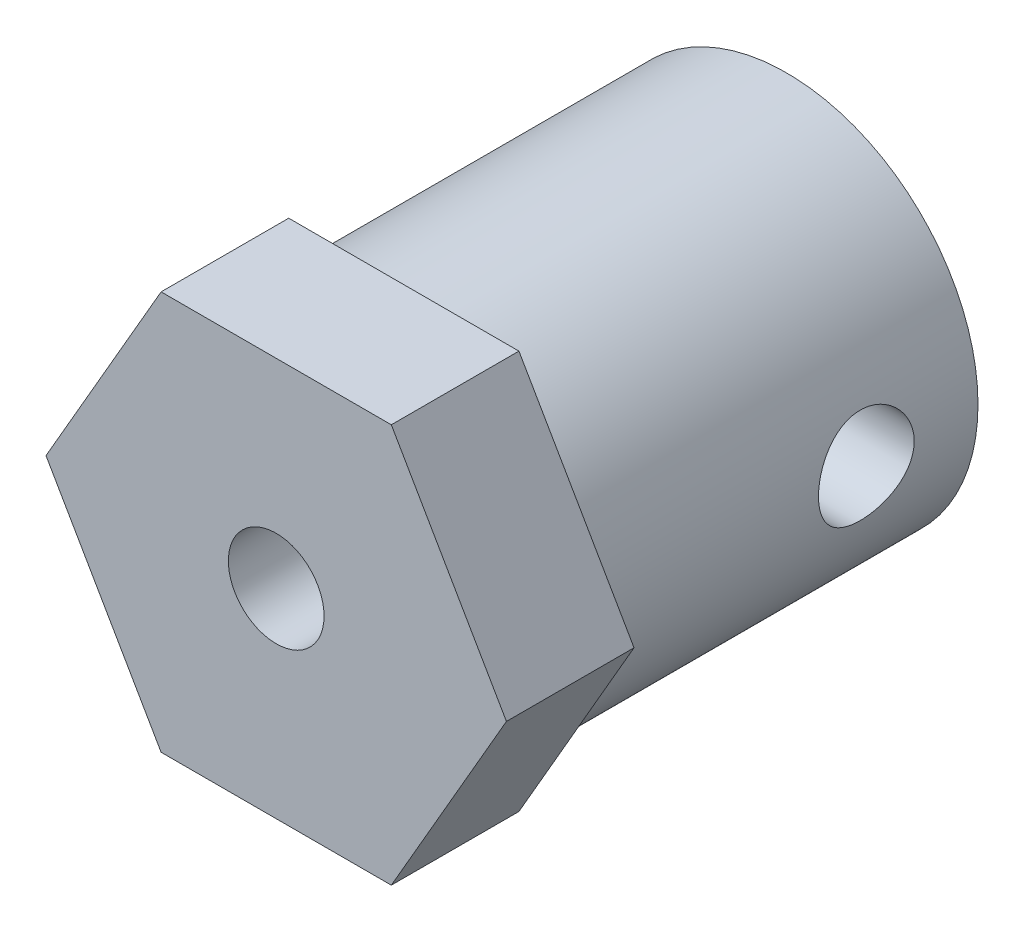
ISO-10303-21;
HEADER;
FILE_DESCRIPTION(('STEP AP214'),'2;1');
FILE_NAME('part.step','',(''),(''),'','','');
FILE_SCHEMA(('AUTOMOTIVE_DESIGN { 1 0 10303 214 1 1 1 1 }'));
ENDSEC;
DATA;
#1=APPLICATION_CONTEXT('core data for automotive mechanical design processes');
#2=APPLICATION_PROTOCOL_DEFINITION('international standard','automotive_design',2000,#1);
#3=PRODUCT_CONTEXT('',#1,'mechanical');
#4=PRODUCT('Part','Part','',(#3));
#5=PRODUCT_RELATED_PRODUCT_CATEGORY('part','',(#4));
#6=PRODUCT_DEFINITION_FORMATION('','',#4);
#7=PRODUCT_DEFINITION_CONTEXT('part definition',#1,'design');
#8=PRODUCT_DEFINITION('design','',#6,#7);
#9=PRODUCT_DEFINITION_SHAPE('','',#8);
#10=(LENGTH_UNIT() NAMED_UNIT(*) SI_UNIT(.MILLI.,.METRE.));
#11=(NAMED_UNIT(*) PLANE_ANGLE_UNIT() SI_UNIT($,.RADIAN.));
#12=(NAMED_UNIT(*) SI_UNIT($,.STERADIAN.) SOLID_ANGLE_UNIT());
#13=UNCERTAINTY_MEASURE_WITH_UNIT(LENGTH_MEASURE(1.E-05),#10,'distance_accuracy_value','');
#14=(GEOMETRIC_REPRESENTATION_CONTEXT(3) GLOBAL_UNCERTAINTY_ASSIGNED_CONTEXT((#13)) GLOBAL_UNIT_ASSIGNED_CONTEXT((#10,
#11,#12)) REPRESENTATION_CONTEXT('',''));
#15=CARTESIAN_POINT('',(0.,0.,0.));
#16=DIRECTION('',(0.,0.,1.));
#17=DIRECTION('',(1.,0.,0.));
#18=AXIS2_PLACEMENT_3D('',#15,#16,#17);
#19=CARTESIAN_POINT('',(0.,0.,-12.));
#20=DIRECTION('',(0.,0.,1.));
#21=DIRECTION('',(1.,0.,0.));
#22=AXIS2_PLACEMENT_3D('',#19,#20,#21);
#23=CYLINDRICAL_SURFACE('',#22,6.);
#24=CARTESIAN_POINT('',(0.,0.,-12.));
#25=DIRECTION('',(0.,0.,-1.));
#26=DIRECTION('',(-1.,0.,0.));
#27=AXIS2_PLACEMENT_3D('',#24,#25,#26);
#28=CIRCLE('',#27,6.);
#29=CARTESIAN_POINT('',(-6.,0.,-12.));
#30=VERTEX_POINT('',#29);
#31=EDGE_CURVE('E192',#30,#30,#28,.T.);
#32=ORIENTED_EDGE('',*,*,#31,.F.);
#33=EDGE_LOOP('',(#32));
#34=FACE_BOUND('',#33,.T.);
#35=CARTESIAN_POINT('',(0.,0.,0.));
#36=DIRECTION('',(0.,0.,-1.));
#37=DIRECTION('',(-1.,0.,0.));
#38=AXIS2_PLACEMENT_3D('',#35,#36,#37);
#39=CIRCLE('',#38,6.);
#40=CARTESIAN_POINT('',(-6.,0.,0.));
#41=VERTEX_POINT('',#40);
#42=EDGE_CURVE('E12',#41,#41,#39,.T.);
#43=ORIENTED_EDGE('',*,*,#42,.T.);
#44=EDGE_LOOP('',(#43));
#45=FACE_BOUND('',#44,.T.);
#46=CARTESIAN_POINT('',(6.,0.,-10.));
#47=CARTESIAN_POINT('',(5.99999859868013,0.082876088669731,-9.99999767426184));
#48=CARTESIAN_POINT('',(5.99826578131828,0.165778157830763,-9.99310844922621));
#49=CARTESIAN_POINT('',(5.99152113829892,0.329206323770532,-9.96577484869299));
#50=CARTESIAN_POINT('',(5.98650745419968,0.409731046870738,-9.94532279046215));
#51=CARTESIAN_POINT('',(5.9737562633204,0.566020872182576,-9.89156074653791));
#52=CARTESIAN_POINT('',(5.96602202842087,0.641791563430002,-9.85826620128472));
#53=CARTESIAN_POINT('',(5.94865343807593,0.786672131904425,-9.77981860995517));
#54=CARTESIAN_POINT('',(5.9390190185405,0.855781784348758,-9.73466516388106));
#55=CARTESIAN_POINT('',(5.91867413591801,0.986801927300918,-9.63279921034579));
#56=CARTESIAN_POINT('',(5.90794707148533,1.04855569006107,-9.57588842504082));
#57=CARTESIAN_POINT('',(5.8867362011753,1.1617489272033,-9.45254779509108));
#58=CARTESIAN_POINT('',(5.87625242288349,1.21318723694913,-9.3861168770535));
#59=CARTESIAN_POINT('',(5.8565477569971,1.30502654279903,-9.24440477326256));
#60=CARTESIAN_POINT('',(5.84734794470605,1.34525221592535,-9.1690067691896));
#61=CARTESIAN_POINT('',(5.83149494812223,1.41239690855052,-9.01225158834164));
#62=CARTESIAN_POINT('',(5.82484135672789,1.43931805543933,-8.93089536667424));
#63=CARTESIAN_POINT('',(5.81500476717551,1.47855483680429,-8.76625650179752));
#64=CARTESIAN_POINT('',(5.81175491075426,1.49115226833334,-8.6830451039502));
#65=CARTESIAN_POINT('',(5.80889362537741,1.50226177506785,-8.51563143098602));
#66=CARTESIAN_POINT('',(5.80928160448644,1.50077614181798,-8.43142931930139));
#67=CARTESIAN_POINT('',(5.81359205496618,1.48398652463928,-8.26658419225552));
#68=CARTESIAN_POINT('',(5.81742863001879,1.46901834019052,-8.18590437853491));
#69=CARTESIAN_POINT('',(5.82806709676484,1.4262241869031,-8.02823894908871));
#70=CARTESIAN_POINT('',(5.83486919970697,1.39839730206942,-7.95125359697102));
#71=CARTESIAN_POINT('',(5.85075113904187,1.33038947793715,-7.80226198374794));
#72=CARTESIAN_POINT('',(5.85985327469421,1.29008666723291,-7.73031382821045));
#73=CARTESIAN_POINT('',(5.87929710846386,1.19835627601495,-7.59408129024316));
#74=CARTESIAN_POINT('',(5.88963902334735,1.14692674880884,-7.52979825193275));
#75=CARTESIAN_POINT('',(5.91075880539781,1.03266342468121,-7.4087963843056));
#76=CARTESIAN_POINT('',(5.92154069477971,0.969546258165857,-7.35234550993865));
#77=CARTESIAN_POINT('',(5.94205965578786,0.834611917503697,-7.2507787575361));
#78=CARTESIAN_POINT('',(5.95179669549415,0.762794477707941,-7.20566322573644));
#79=CARTESIAN_POINT('',(5.96917732094183,0.612115888681389,-7.12794941377562));
#80=CARTESIAN_POINT('',(5.97681360127725,0.533231393208621,-7.09539465974558));
#81=CARTESIAN_POINT('',(5.98907916991419,0.370876008142881,-7.04408269429043));
#82=CARTESIAN_POINT('',(5.99370903339281,0.287405999150484,-7.02532284358187));
#83=CARTESIAN_POINT('',(5.99935499271375,0.120539970390027,-7.00254243444117));
#84=CARTESIAN_POINT('',(6.00046053508279,0.0371967199882096,-6.9981569739247));
#85=CARTESIAN_POINT('',(5.99918804814451,-0.129032874801508,-7.00324900205549));
#86=CARTESIAN_POINT('',(5.99681033241847,-0.211919259644595,-7.01272524279914));
#87=CARTESIAN_POINT('',(5.98889581127357,-0.373614268776491,-7.04497090839138));
#88=CARTESIAN_POINT('',(5.98340634185811,-0.452465118968754,-7.06754126347699));
#89=CARTESIAN_POINT('',(5.96988706634134,-0.60525729245251,-7.12510708402845));
#90=CARTESIAN_POINT('',(5.96185700369892,-0.679198119032633,-7.16010380431317));
#91=CARTESIAN_POINT('',(5.9439330792631,-0.821523134429846,-7.24223612887473));
#92=CARTESIAN_POINT('',(5.93400867366932,-0.889785441835829,-7.28957611239677));
#93=CARTESIAN_POINT('',(5.91344509187419,-1.01752661364324,-7.39478990879697));
#94=CARTESIAN_POINT('',(5.90280579251705,-1.07700395897301,-7.45266553961691));
#95=CARTESIAN_POINT('',(5.88168956960771,-1.18699056807273,-7.57900196084447));
#96=CARTESIAN_POINT('',(5.87122304187281,-1.23724386762203,-7.64768770300243));
#97=CARTESIAN_POINT('',(5.85192878377239,-1.3255107590127,-7.79273263446572));
#98=CARTESIAN_POINT('',(5.84310098067026,-1.36352489415793,-7.86909148295976));
#99=CARTESIAN_POINT('',(5.82818094734665,-1.42595142060929,-8.02690572241308));
#100=CARTESIAN_POINT('',(5.82207255291906,-1.45044439665406,-8.10832762834401));
#101=CARTESIAN_POINT('',(5.81326744090184,-1.48534565995378,-8.27430963788911));
#102=CARTESIAN_POINT('',(5.81056997719936,-1.49575702747865,-8.35886905103249));
#103=CARTESIAN_POINT('',(5.80894901203957,-1.50203859033399,-8.5261210238552));
#104=CARTESIAN_POINT('',(5.80991932728264,-1.49831789778011,-8.60879743512473));
#105=CARTESIAN_POINT('',(5.81527909007843,-1.47737727831286,-8.77230388866798));
#106=CARTESIAN_POINT('',(5.81966846891857,-1.46015762268677,-8.85313396801365));
#107=CARTESIAN_POINT('',(5.83131260682723,-1.41293131944279,-9.01020845906541));
#108=CARTESIAN_POINT('',(5.8385501523631,-1.38300140468037,-9.08647730524021));
#109=CARTESIAN_POINT('',(5.85507755724829,-1.31126491360507,-9.23296538271369));
#110=CARTESIAN_POINT('',(5.86436770120773,-1.26945669003419,-9.30318377318692));
#111=CARTESIAN_POINT('',(5.88425634263512,-1.17386774863713,-9.43755462900202));
#112=CARTESIAN_POINT('',(5.89488264831757,-1.11980316291225,-9.50150107342396));
#113=CARTESIAN_POINT('',(5.91608027246286,-1.00178937118973,-9.61954704479541));
#114=CARTESIAN_POINT('',(5.9266515772706,-0.937837821261142,-9.67364423011297));
#115=CARTESIAN_POINT('',(5.94677655647663,-0.800467586702587,-9.77141130856461));
#116=CARTESIAN_POINT('',(5.95630833365868,-0.726898422316384,-9.81487461367158));
#117=CARTESIAN_POINT('',(5.97304924975119,-0.573266059510474,-9.88874746294053));
#118=CARTESIAN_POINT('',(5.98026005199781,-0.493207563436737,-9.91916636064853));
#119=CARTESIAN_POINT('',(5.99048059565542,-0.34441025324347,-9.96157183032965));
#120=CARTESIAN_POINT('',(5.99402585052691,-0.276380170908067,-9.97595124305343));
#121=CARTESIAN_POINT('',(5.99878605231948,-0.138906071536282,-9.99516594362194));
#122=CARTESIAN_POINT('',(6.00000117450894,-0.0694621612426158,-10.0000019493053));
#123=CARTESIAN_POINT('',(6.,0.,-10.));
#124=B_SPLINE_CURVE_WITH_KNOTS('',3,(#46,#47,#48,#49,#50,#51,#52,#53,#54,#55,#56,#57,#58,#59,
#60,#61,#62,#63,#64,#65,#66,#67,#68,#69,#70,#71,#72,#73,#74,#75,#76,#77,#78,#79,#80,#81,#82,#83,
#84,#85,#86,#87,#88,#89,#90,#91,#92,#93,#94,#95,#96,#97,#98,#99,#100,#101,#102,#103,#104,#105,
#106,#107,#108,#109,#110,#111,#112,#113,#114,#115,#116,#117,#118,#119,#120,#121,#122,#123),
.UNSPECIFIED.,.T.,.F.,(4,2,2,2,2,2,2,2,2,2,2,2,2,2,2,2,2,2,2,2,2,2,2,2,2,2,2,2,2,2,2,2,2,2,2,2,
2,2,4),(0.,0.248373712471889,0.496888237763899,0.745104902286104,0.993329940169327,
1.24614435437139,1.49898729580062,1.75558647545806,2.01214461169368,2.2635629509943,
2.51494038112696,2.76022497007017,3.00552703466038,3.25330527873878,3.50112690836162,
3.75601500969019,4.01091089558246,4.26668229009113,4.52240473688642,4.77158308949275,
5.02073901112742,5.26620274514036,5.51169127322289,5.76153587565351,6.01142363008018,
6.26744509204475,6.52345518749507,6.77792254614035,7.03233423252406,7.27943780398611,
7.52653640956033,7.77216400559445,8.017825681369,8.26989576409908,8.52202569770416,
8.77872185499586,9.03523363821348,9.24342242942147,9.45159556043037),.UNSPECIFIED.);
#125=CARTESIAN_POINT('',(6.,0.,-10.));
#126=VERTEX_POINT('',#125);
#127=EDGE_CURVE('E204',#126,#126,#124,.T.);
#128=ORIENTED_EDGE('',*,*,#127,.F.);
#129=EDGE_LOOP('',(#128));
#130=FACE_BOUND('',#129,.T.);
#131=ADVANCED_FACE('F45',(#34,#45,#130),#23,.T.);
#132=CARTESIAN_POINT('',(0.,0.,-12.));
#133=DIRECTION('',(0.,0.,1.));
#134=DIRECTION('',(1.,0.,0.));
#135=AXIS2_PLACEMENT_3D('',#132,#133,#134);
#136=CYLINDRICAL_SURFACE('',#135,3.175);
#137=CARTESIAN_POINT('',(0.,0.,0.));
#138=DIRECTION('',(0.,0.,-1.));
#139=DIRECTION('',(-1.,0.,0.));
#140=AXIS2_PLACEMENT_3D('',#137,#138,#139);
#141=CIRCLE('',#140,3.175);
#142=CARTESIAN_POINT('',(-3.175,0.,0.));
#143=VERTEX_POINT('',#142);
#144=EDGE_CURVE('E200',#143,#143,#141,.T.);
#145=ORIENTED_EDGE('',*,*,#144,.F.);
#146=EDGE_LOOP('',(#145));
#147=FACE_BOUND('',#146,.T.);
#148=CARTESIAN_POINT('',(0.,0.,-12.));
#149=DIRECTION('',(0.,0.,-1.));
#150=DIRECTION('',(-1.,0.,0.));
#151=AXIS2_PLACEMENT_3D('',#148,#149,#150);
#152=CIRCLE('',#151,3.175);
#153=CARTESIAN_POINT('',(-3.175,0.,-12.));
#154=VERTEX_POINT('',#153);
#155=EDGE_CURVE('E199',#154,#154,#152,.T.);
#156=ORIENTED_EDGE('',*,*,#155,.T.);
#157=EDGE_LOOP('',(#156));
#158=FACE_BOUND('',#157,.T.);
#159=CARTESIAN_POINT('',(3.175,0.,-10.));
#160=CARTESIAN_POINT('',(3.17499621985294,0.0793696056331877,-9.99999552610351));
#161=CARTESIAN_POINT('',(3.17199120370814,0.158848966213319,-9.99366335348418));
#162=CARTESIAN_POINT('',(3.16026762742416,0.3154907966577,-9.9685996128575));
#163=CARTESIAN_POINT('',(3.15153670753249,0.392647876041672,-9.94984122112576));
#164=CARTESIAN_POINT('',(3.1292818514019,0.542134614016449,-9.90080463386028));
#165=CARTESIAN_POINT('',(3.11577583396693,0.614481134826973,-9.87056947468804));
#166=CARTESIAN_POINT('',(3.08523557557938,0.75298275747988,-9.79964446831745));
#167=CARTESIAN_POINT('',(3.06820187122341,0.819138798737004,-9.75895621091421));
#168=CARTESIAN_POINT('',(3.03109215002452,0.947531977551391,-9.66568662754687));
#169=CARTESIAN_POINT('',(3.01089949607389,1.00934531536298,-9.61256891765261));
#170=CARTESIAN_POINT('',(2.97016877751052,1.12356872804671,-9.49709401541805));
#171=CARTESIAN_POINT('',(2.94963048974006,1.17597245123061,-9.43473063351147));
#172=CARTESIAN_POINT('',(2.90895734211161,1.27340721108708,-9.29748436454971));
#173=CARTESIAN_POINT('',(2.88894252906622,1.31770529611402,-9.22204154314482));
#174=CARTESIAN_POINT('',(2.85350194913633,1.39279860497067,-9.06371450605077));
#175=CARTESIAN_POINT('',(2.83807319122875,1.4236026358555,-8.98083518657092));
#176=CARTESIAN_POINT('',(2.81484981523147,1.46896762087975,-8.81481732997647));
#177=CARTESIAN_POINT('',(2.80667245171199,1.48434942407678,-8.73195910458647));
#178=CARTESIAN_POINT('',(2.79782290647243,1.50096994970779,-8.56446669966953));
#179=CARTESIAN_POINT('',(2.79714463118969,1.5022201551264,-8.47983401805994));
#180=CARTESIAN_POINT('',(2.80305593263809,1.49114871052962,-8.32062469140227));
#181=CARTESIAN_POINT('',(2.80889771224103,1.48022366031688,-8.24591684055565));
#182=CARTESIAN_POINT('',(2.82589657910715,1.44750469243097,-8.09955531913525));
#183=CARTESIAN_POINT('',(2.83705508237193,1.42570787921159,-8.02790246774061));
#184=CARTESIAN_POINT('',(2.86368711079333,1.37144042107045,-7.88767854274785));
#185=CARTESIAN_POINT('',(2.87925460442575,1.33873421633753,-7.8192173067294));
#186=CARTESIAN_POINT('',(2.91294481240157,1.26375034917988,-7.68844422930819));
#187=CARTESIAN_POINT('',(2.93106865023239,1.22146847336964,-7.62613511227864));
#188=CARTESIAN_POINT('',(2.97027967308475,1.12301829304093,-7.50211398210142));
#189=CARTESIAN_POINT('',(2.99147184174414,1.06582685913966,-7.44124465826451));
#190=CARTESIAN_POINT('',(3.03276969244738,0.941911654521735,-7.32963307898786));
#191=CARTESIAN_POINT('',(3.05287495516681,0.875184240523145,-7.27889471198726));
#192=CARTESIAN_POINT('',(3.09065813188422,0.730900451942523,-7.18723446950541));
#193=CARTESIAN_POINT('',(3.10821737934191,0.653032764749387,-7.14674987490941));
#194=CARTESIAN_POINT('',(3.13795896561378,0.490549806409962,-7.07976514725873));
#195=CARTESIAN_POINT('',(3.15014513198241,0.405939389394614,-7.05325505672055));
#196=CARTESIAN_POINT('',(3.16698849385516,0.239325331183661,-7.01695327830055));
#197=CARTESIAN_POINT('',(3.17215069636453,0.157618085372368,-7.00603697774867));
#198=CARTESIAN_POINT('',(3.17605374308904,-0.00662006237334249,-6.99776549827472));
#199=CARTESIAN_POINT('',(3.17479716715133,-0.0891506200914338,-7.00040487103399));
#200=CARTESIAN_POINT('',(3.16631250425399,-0.246790904756256,-7.01845895022594));
#201=CARTESIAN_POINT('',(3.15949303898597,-0.322025617263289,-7.03299968212115));
#202=CARTESIAN_POINT('',(3.14106249856194,-0.468859911387633,-7.07312746629385));
#203=CARTESIAN_POINT('',(3.12945086824544,-0.540459070755479,-7.09871579842439));
#204=CARTESIAN_POINT('',(3.10206629000487,-0.680482664613306,-7.16097277598054));
#205=CARTESIAN_POINT('',(3.0861775760538,-0.748744433690326,-7.19795459585581));
#206=CARTESIAN_POINT('',(3.05182842645659,-0.878333413113473,-7.28160542554883));
#207=CARTESIAN_POINT('',(3.0333668635778,-0.939657562453441,-7.32827868585653));
#208=CARTESIAN_POINT('',(2.99374847615918,-1.05944471500474,-7.4348401643062));
#209=CARTESIAN_POINT('',(2.97249840501299,-1.11715821701518,-7.49553803008256));
#210=CARTESIAN_POINT('',(2.9310107026401,-1.22187582163969,-7.6259200433733));
#211=CARTESIAN_POINT('',(2.91077359415055,-1.26887443843489,-7.69560876557418));
#212=CARTESIAN_POINT('',(2.8729842223829,-1.3523177360002,-7.84515860569976));
#213=CARTESIAN_POINT('',(2.85555063245793,-1.3883357483136,-7.9252902768506));
#214=CARTESIAN_POINT('',(2.82679504093384,-1.44599796651068,-8.09157573608092));
#215=CARTESIAN_POINT('',(2.81546607860886,-1.46765854978946,-8.17772253828127));
#216=CARTESIAN_POINT('',(2.80148148307169,-1.49416555358527,-8.34513659709301));
#217=CARTESIAN_POINT('',(2.79812792823293,-1.50036748851185,-8.42613047173134));
#218=CARTESIAN_POINT('',(2.79854075870542,-1.4995991124721,-8.58802567182791));
#219=CARTESIAN_POINT('',(2.80230499174775,-1.49263278331129,-8.66892701786345));
#220=CARTESIAN_POINT('',(2.81582109373829,-1.46695547456854,-8.82186185816675));
#221=CARTESIAN_POINT('',(2.82509293077013,-1.44918362899974,-8.894100315709));
#222=CARTESIAN_POINT('',(2.84807658169596,-1.40347262111118,-9.03452895410737));
#223=CARTESIAN_POINT('',(2.86178973121637,-1.37553039996267,-9.1027179098565));
#224=CARTESIAN_POINT('',(2.89323433363553,-1.30816165903835,-9.23811055182919));
#225=CARTESIAN_POINT('',(2.9111726221189,-1.26809407534009,-9.30494596956031));
#226=CARTESIAN_POINT('',(2.94862781691945,-1.17838069734069,-9.43136079818433));
#227=CARTESIAN_POINT('',(2.96814547541437,-1.12873032344155,-9.49093671747963));
#228=CARTESIAN_POINT('',(3.00898948839188,-1.01518945377103,-9.6075560784686));
#229=CARTESIAN_POINT('',(3.03029315236505,-0.950355540908528,-9.66369381341707));
#230=CARTESIAN_POINT('',(3.07039060771353,-0.811506446201228,-9.76444175427494));
#231=CARTESIAN_POINT('',(3.08918318329392,-0.737486850130152,-9.80904638589811));
#232=CARTESIAN_POINT('',(3.12214803509559,-0.582310323359665,-9.8850463197749));
#233=CARTESIAN_POINT('',(3.13633626105316,-0.501179295246571,-9.91648733383919));
#234=CARTESIAN_POINT('',(3.15849550789229,-0.334041202489529,-9.96490242402554));
#235=CARTESIAN_POINT('',(3.16648489362115,-0.248049357078896,-9.98191924759625));
#236=CARTESIAN_POINT('',(3.17226666174443,-0.134449327489633,-9.99420643339842));
#237=CARTESIAN_POINT('',(3.17328951708221,-0.107619750816228,-9.99637655199677));
#238=CARTESIAN_POINT('',(3.17465683516496,-0.0538643319459671,-9.99927411038089));
#239=CARTESIAN_POINT('',(3.17500128300303,-0.0269384876468124,-10.0000015184655));
#240=CARTESIAN_POINT('',(3.175,0.,-10.));
#241=B_SPLINE_CURVE_WITH_KNOTS('',3,(#159,#160,#161,#162,#163,#164,#165,#166,#167,#168,#169,
#170,#171,#172,#173,#174,#175,#176,#177,#178,#179,#180,#181,#182,#183,#184,#185,#186,#187,#188,
#189,#190,#191,#192,#193,#194,#195,#196,#197,#198,#199,#200,#201,#202,#203,#204,#205,#206,#207,
#208,#209,#210,#211,#212,#213,#214,#215,#216,#217,#218,#219,#220,#221,#222,#223,#224,#225,#226,
#227,#228,#229,#230,#231,#232,#233,#234,#235,#236,#237,#238,#239,#240),.UNSPECIFIED.,.T.,.F.,(4,
2,2,2,2,2,2,2,2,2,2,2,2,2,2,2,2,2,2,2,2,2,2,2,2,2,2,2,2,2,2,2,2,2,2,2,2,2,2,2,4),(0.,
0.237998863435126,0.47651316203436,0.714141760487185,0.951734239756923,1.202566267352,
1.45356698050229,1.72144991719772,1.98915775546694,2.24170968929962,2.4940563909499,
2.72018464462581,2.94637315667183,3.17780125644151,3.40933138528568,3.66670059385931,
3.92416839616743,4.19124985366181,4.45814074508091,4.70459764976703,4.95095550583969,
5.18069145066331,5.41045401730285,5.64720089890939,5.88405183355052,6.14213867221334,
6.40035735120201,6.66760822573516,6.93455372246491,7.17710763594644,7.41958821796885,
7.64352093670394,7.8675210608749,8.10644389425157,8.34548119240927,8.60934561245706,
8.87333732850239,9.13640455025374,9.39868939422997,9.47946576344204,9.56024390756226),.UNSPECIFIED.);
#242=CARTESIAN_POINT('',(3.175,0.,-10.));
#243=VERTEX_POINT('',#242);
#244=EDGE_CURVE('E49',#243,#243,#241,.T.);
#245=ORIENTED_EDGE('',*,*,#244,.T.);
#246=EDGE_LOOP('',(#245));
#247=FACE_BOUND('',#246,.T.);
#248=ADVANCED_FACE('F222',(#147,#158,#247),#136,.F.);
#249=CARTESIAN_POINT('',(0.,0.,0.));
#250=DIRECTION('',(0.,0.,1.));
#251=DIRECTION('',(1.,0.,0.));
#252=AXIS2_PLACEMENT_3D('',#249,#250,#251);
#253=PLANE('',#252);
#254=CARTESIAN_POINT('',(0.,0.,0.));
#255=DIRECTION('',(0.,0.,1.));
#256=DIRECTION('',(1.,0.,0.));
#257=AXIS2_PLACEMENT_3D('',#254,#255,#256);
#258=CIRCLE('',#257,1.5);
#259=CARTESIAN_POINT('',(1.5,0.,0.));
#260=VERTEX_POINT('',#259);
#261=EDGE_CURVE('E188',#260,#260,#258,.T.);
#262=ORIENTED_EDGE('',*,*,#261,.T.);
#263=EDGE_LOOP('',(#262));
#264=FACE_BOUND('',#263,.T.);
#265=ORIENTED_EDGE('',*,*,#144,.T.);
#266=EDGE_LOOP('',(#265));
#267=FACE_BOUND('',#266,.T.);
#268=ADVANCED_FACE('F226',(#264,#267),#253,.F.);
#269=CARTESIAN_POINT('',(0.,0.,4.));
#270=DIRECTION('',(0.,0.,1.));
#271=DIRECTION('',(1.,0.,0.));
#272=AXIS2_PLACEMENT_3D('',#269,#270,#271);
#273=PLANE('',#272);
#274=DIRECTION('',(-0.5,0.866025403784438,0.));
#275=VECTOR('',#274,1.);
#276=CARTESIAN_POINT('',(7.21687836487032,0.,4.));
#277=LINE('',#276,#275);
#278=CARTESIAN_POINT('',(7.21687836487032,0.,4.));
#279=VERTEX_POINT('',#278);
#280=CARTESIAN_POINT('',(3.60843918243516,6.25,4.));
#281=VERTEX_POINT('',#280);
#282=EDGE_CURVE('E161',#279,#281,#277,.T.);
#283=ORIENTED_EDGE('',*,*,#282,.T.);
#284=DIRECTION('',(-1.,0.,0.));
#285=VECTOR('',#284,1.);
#286=CARTESIAN_POINT('',(3.60843918243516,6.25,4.));
#287=LINE('',#286,#285);
#288=CARTESIAN_POINT('',(-3.60843918243516,6.25,4.));
#289=VERTEX_POINT('',#288);
#290=EDGE_CURVE('E108',#281,#289,#287,.T.);
#291=ORIENTED_EDGE('',*,*,#290,.T.);
#292=DIRECTION('',(-0.5,-0.866025403784439,0.));
#293=VECTOR('',#292,1.);
#294=CARTESIAN_POINT('',(-3.60843918243516,6.25,4.));
#295=LINE('',#294,#293);
#296=CARTESIAN_POINT('',(-7.21687836487032,0.,4.));
#297=VERTEX_POINT('',#296);
#298=EDGE_CURVE('E122',#289,#297,#295,.T.);
#299=ORIENTED_EDGE('',*,*,#298,.T.);
#300=DIRECTION('',(0.5,-0.866025403784438,0.));
#301=VECTOR('',#300,1.);
#302=CARTESIAN_POINT('',(-7.21687836487032,0.,4.));
#303=LINE('',#302,#301);
#304=CARTESIAN_POINT('',(-3.60843918243516,-6.25,4.));
#305=VERTEX_POINT('',#304);
#306=EDGE_CURVE('E115',#297,#305,#303,.T.);
#307=ORIENTED_EDGE('',*,*,#306,.T.);
#308=DIRECTION('',(1.,0.,0.));
#309=VECTOR('',#308,1.);
#310=CARTESIAN_POINT('',(-3.60843918243516,-6.25,4.));
#311=LINE('',#310,#309);
#312=CARTESIAN_POINT('',(3.60843918243516,-6.25,4.));
#313=VERTEX_POINT('',#312);
#314=EDGE_CURVE('E120',#305,#313,#311,.T.);
#315=ORIENTED_EDGE('',*,*,#314,.T.);
#316=DIRECTION('',(0.5,0.866025403784439,0.));
#317=VECTOR('',#316,1.);
#318=CARTESIAN_POINT('',(3.60843918243516,-6.25,4.));
#319=LINE('',#318,#317);
#320=EDGE_CURVE('E70',#313,#279,#319,.T.);
#321=ORIENTED_EDGE('',*,*,#320,.T.);
#322=EDGE_LOOP('',(#283,#291,#299,#307,#315,#321));
#323=FACE_BOUND('',#322,.T.);
#324=CARTESIAN_POINT('',(0.,0.,4.));
#325=DIRECTION('',(0.,0.,1.));
#326=DIRECTION('',(1.,0.,0.));
#327=AXIS2_PLACEMENT_3D('',#324,#325,#326);
#328=CIRCLE('',#327,1.5);
#329=CARTESIAN_POINT('',(1.5,0.,4.));
#330=VERTEX_POINT('',#329);
#331=EDGE_CURVE('E149',#330,#330,#328,.T.);
#332=ORIENTED_EDGE('',*,*,#331,.F.);
#333=EDGE_LOOP('',(#332));
#334=FACE_BOUND('',#333,.T.);
#335=ADVANCED_FACE('F117',(#323,#334),#273,.T.);
#336=ORIENTED_EDGE('',*,*,#42,.F.);
#337=EDGE_LOOP('',(#336));
#338=FACE_BOUND('',#337,.T.);
#339=DIRECTION('',(-0.5,0.866025403784438,0.));
#340=VECTOR('',#339,1.);
#341=CARTESIAN_POINT('',(7.21687836487032,0.,0.));
#342=LINE('',#341,#340);
#343=CARTESIAN_POINT('',(7.21687836487032,0.,0.));
#344=VERTEX_POINT('',#343);
#345=CARTESIAN_POINT('',(3.60843918243516,6.25,0.));
#346=VERTEX_POINT('',#345);
#347=EDGE_CURVE('E144',#344,#346,#342,.T.);
#348=ORIENTED_EDGE('',*,*,#347,.F.);
#349=DIRECTION('',(0.5,0.866025403784439,0.));
#350=VECTOR('',#349,1.);
#351=CARTESIAN_POINT('',(3.60843918243516,-6.25,0.));
#352=LINE('',#351,#350);
#353=CARTESIAN_POINT('',(3.60843918243516,-6.25,0.));
#354=VERTEX_POINT('',#353);
#355=EDGE_CURVE('E99',#354,#344,#352,.T.);
#356=ORIENTED_EDGE('',*,*,#355,.F.);
#357=DIRECTION('',(1.,0.,0.));
#358=VECTOR('',#357,1.);
#359=CARTESIAN_POINT('',(-3.60843918243516,-6.25,0.));
#360=LINE('',#359,#358);
#361=CARTESIAN_POINT('',(-3.60843918243516,-6.25,0.));
#362=VERTEX_POINT('',#361);
#363=EDGE_CURVE('E93',#362,#354,#360,.T.);
#364=ORIENTED_EDGE('',*,*,#363,.F.);
#365=DIRECTION('',(0.5,-0.866025403784438,0.));
#366=VECTOR('',#365,1.);
#367=CARTESIAN_POINT('',(-7.21687836487032,0.,0.));
#368=LINE('',#367,#366);
#369=CARTESIAN_POINT('',(-7.21687836487032,0.,0.));
#370=VERTEX_POINT('',#369);
#371=EDGE_CURVE('E131',#370,#362,#368,.T.);
#372=ORIENTED_EDGE('',*,*,#371,.F.);
#373=DIRECTION('',(-0.5,-0.866025403784439,0.));
#374=VECTOR('',#373,1.);
#375=CARTESIAN_POINT('',(-3.60843918243516,6.25,0.));
#376=LINE('',#375,#374);
#377=CARTESIAN_POINT('',(-3.60843918243516,6.25,0.));
#378=VERTEX_POINT('',#377);
#379=EDGE_CURVE('E152',#378,#370,#376,.T.);
#380=ORIENTED_EDGE('',*,*,#379,.F.);
#381=DIRECTION('',(-1.,0.,0.));
#382=VECTOR('',#381,1.);
#383=CARTESIAN_POINT('',(3.60843918243516,6.25,0.));
#384=LINE('',#383,#382);
#385=EDGE_CURVE('E148',#346,#378,#384,.T.);
#386=ORIENTED_EDGE('',*,*,#385,.F.);
#387=EDGE_LOOP('',(#348,#356,#364,#372,#380,#386));
#388=FACE_BOUND('',#387,.T.);
#389=ADVANCED_FACE('F178',(#338,#388),#253,.F.);
#390=CARTESIAN_POINT('',(7.21687836487032,0.,4.));
#391=DIRECTION('',(-0.866025403784438,-0.5,0.));
#392=DIRECTION('',(0.5,-0.866025403784439,0.));
#393=AXIS2_PLACEMENT_3D('',#390,#391,#392);
#394=PLANE('',#393);
#395=ORIENTED_EDGE('',*,*,#347,.T.);
#396=DIRECTION('',(0.,0.,-1.));
#397=VECTOR('',#396,1.);
#398=CARTESIAN_POINT('',(3.60843918243516,6.25,4.));
#399=LINE('',#398,#397);
#400=EDGE_CURVE('E61',#281,#346,#399,.T.);
#401=ORIENTED_EDGE('',*,*,#400,.F.);
#402=ORIENTED_EDGE('',*,*,#282,.F.);
#403=DIRECTION('',(0.,0.,-1.));
#404=VECTOR('',#403,1.);
#405=CARTESIAN_POINT('',(7.21687836487032,0.,4.));
#406=LINE('',#405,#404);
#407=EDGE_CURVE('E140',#279,#344,#406,.T.);
#408=ORIENTED_EDGE('',*,*,#407,.T.);
#409=EDGE_LOOP('',(#395,#401,#402,#408));
#410=FACE_BOUND('',#409,.T.);
#411=ADVANCED_FACE('F47',(#410),#394,.F.);
#412=CARTESIAN_POINT('',(3.60843918243516,6.25,4.));
#413=DIRECTION('',(0.,-1.,0.));
#414=DIRECTION('',(1.,0.,0.));
#415=AXIS2_PLACEMENT_3D('',#412,#413,#414);
#416=PLANE('',#415);
#417=ORIENTED_EDGE('',*,*,#385,.T.);
#418=DIRECTION('',(0.,0.,-1.));
#419=VECTOR('',#418,1.);
#420=CARTESIAN_POINT('',(-3.60843918243516,6.25,4.));
#421=LINE('',#420,#419);
#422=EDGE_CURVE('E168',#289,#378,#421,.T.);
#423=ORIENTED_EDGE('',*,*,#422,.F.);
#424=ORIENTED_EDGE('',*,*,#290,.F.);
#425=ORIENTED_EDGE('',*,*,#400,.T.);
#426=EDGE_LOOP('',(#417,#423,#424,#425));
#427=FACE_BOUND('',#426,.T.);
#428=ADVANCED_FACE('F173',(#427),#416,.F.);
#429=CARTESIAN_POINT('',(-3.60843918243516,6.25,4.));
#430=DIRECTION('',(0.866025403784439,-0.5,0.));
#431=DIRECTION('',(0.5,0.866025403784439,0.));
#432=AXIS2_PLACEMENT_3D('',#429,#430,#431);
#433=PLANE('',#432);
#434=ORIENTED_EDGE('',*,*,#379,.T.);
#435=DIRECTION('',(0.,0.,-1.));
#436=VECTOR('',#435,1.);
#437=CARTESIAN_POINT('',(-7.21687836487032,0.,4.));
#438=LINE('',#437,#436);
#439=EDGE_CURVE('E133',#297,#370,#438,.T.);
#440=ORIENTED_EDGE('',*,*,#439,.F.);
#441=ORIENTED_EDGE('',*,*,#298,.F.);
#442=ORIENTED_EDGE('',*,*,#422,.T.);
#443=EDGE_LOOP('',(#434,#440,#441,#442));
#444=FACE_BOUND('',#443,.T.);
#445=ADVANCED_FACE('F181',(#444),#433,.F.);
#446=CARTESIAN_POINT('',(-7.21687836487032,0.,4.));
#447=DIRECTION('',(0.866025403784438,0.5,0.));
#448=DIRECTION('',(-0.5,0.866025403784438,0.));
#449=AXIS2_PLACEMENT_3D('',#446,#447,#448);
#450=PLANE('',#449);
#451=ORIENTED_EDGE('',*,*,#371,.T.);
#452=DIRECTION('',(0.,0.,-1.));
#453=VECTOR('',#452,1.);
#454=CARTESIAN_POINT('',(-3.60843918243516,-6.25,4.));
#455=LINE('',#454,#453);
#456=EDGE_CURVE('E128',#305,#362,#455,.T.);
#457=ORIENTED_EDGE('',*,*,#456,.F.);
#458=ORIENTED_EDGE('',*,*,#306,.F.);
#459=ORIENTED_EDGE('',*,*,#439,.T.);
#460=EDGE_LOOP('',(#451,#457,#458,#459));
#461=FACE_BOUND('',#460,.T.);
#462=ADVANCED_FACE('F129',(#461),#450,.F.);
#463=CARTESIAN_POINT('',(-3.60843918243516,-6.25,4.));
#464=DIRECTION('',(0.,1.,0.));
#465=DIRECTION('',(-1.,0.,0.));
#466=AXIS2_PLACEMENT_3D('',#463,#464,#465);
#467=PLANE('',#466);
#468=ORIENTED_EDGE('',*,*,#363,.T.);
#469=DIRECTION('',(0.,0.,-1.));
#470=VECTOR('',#469,1.);
#471=CARTESIAN_POINT('',(3.60843918243516,-6.25,4.));
#472=LINE('',#471,#470);
#473=EDGE_CURVE('E134',#313,#354,#472,.T.);
#474=ORIENTED_EDGE('',*,*,#473,.F.);
#475=ORIENTED_EDGE('',*,*,#314,.F.);
#476=ORIENTED_EDGE('',*,*,#456,.T.);
#477=EDGE_LOOP('',(#468,#474,#475,#476));
#478=FACE_BOUND('',#477,.T.);
#479=ADVANCED_FACE('F136',(#478),#467,.F.);
#480=CARTESIAN_POINT('',(3.60843918243516,-6.25,4.));
#481=DIRECTION('',(-0.866025403784439,0.5,0.));
#482=DIRECTION('',(-0.5,-0.866025403784439,0.));
#483=AXIS2_PLACEMENT_3D('',#480,#481,#482);
#484=PLANE('',#483);
#485=ORIENTED_EDGE('',*,*,#355,.T.);
#486=ORIENTED_EDGE('',*,*,#407,.F.);
#487=ORIENTED_EDGE('',*,*,#320,.F.);
#488=ORIENTED_EDGE('',*,*,#473,.T.);
#489=EDGE_LOOP('',(#485,#486,#487,#488));
#490=FACE_BOUND('',#489,.T.);
#491=ADVANCED_FACE('F234',(#490),#484,.F.);
#492=CARTESIAN_POINT('',(0.,0.,4.));
#493=DIRECTION('',(0.,0.,-1.));
#494=DIRECTION('',(-1.,0.,0.));
#495=AXIS2_PLACEMENT_3D('',#492,#493,#494);
#496=CYLINDRICAL_SURFACE('',#495,1.5);
#497=ORIENTED_EDGE('',*,*,#331,.T.);
#498=EDGE_LOOP('',(#497));
#499=FACE_BOUND('',#498,.T.);
#500=ORIENTED_EDGE('',*,*,#261,.F.);
#501=EDGE_LOOP('',(#500));
#502=FACE_BOUND('',#501,.T.);
#503=ADVANCED_FACE('F229',(#499,#502),#496,.F.);
#504=CARTESIAN_POINT('',(0.,0.,-12.));
#505=DIRECTION('',(0.,0.,-1.));
#506=DIRECTION('',(-1.,0.,0.));
#507=AXIS2_PLACEMENT_3D('',#504,#505,#506);
#508=PLANE('',#507);
#509=ORIENTED_EDGE('',*,*,#31,.T.);
#510=EDGE_LOOP('',(#509));
#511=FACE_BOUND('',#510,.T.);
#512=ORIENTED_EDGE('',*,*,#155,.F.);
#513=EDGE_LOOP('',(#512));
#514=FACE_BOUND('',#513,.T.);
#515=ADVANCED_FACE('F220',(#511,#514),#508,.T.);
#516=CARTESIAN_POINT('',(10.,0.,-8.5));
#517=DIRECTION('',(-1.,0.,0.));
#518=DIRECTION('',(0.,0.,1.));
#519=AXIS2_PLACEMENT_3D('',#516,#517,#518);
#520=CYLINDRICAL_SURFACE('',#519,1.5);
#521=ORIENTED_EDGE('',*,*,#244,.F.);
#522=EDGE_LOOP('',(#521));
#523=FACE_BOUND('',#522,.T.);
#524=ORIENTED_EDGE('',*,*,#127,.T.);
#525=EDGE_LOOP('',(#524));
#526=FACE_BOUND('',#525,.T.);
#527=ADVANCED_FACE('F217',(#523,#526),#520,.F.);
#528=CLOSED_SHELL('',(#131,#248,#268,#335,#389,#411,#428,#445,#462,#479,#491,#503,#515,#527));
#529=MANIFOLD_SOLID_BREP('B2',#528);
#530=ADVANCED_BREP_SHAPE_REPRESENTATION('',(#18,#529),#14);
#531=SHAPE_DEFINITION_REPRESENTATION(#9,#530);
ENDSEC;
END-ISO-10303-21;
